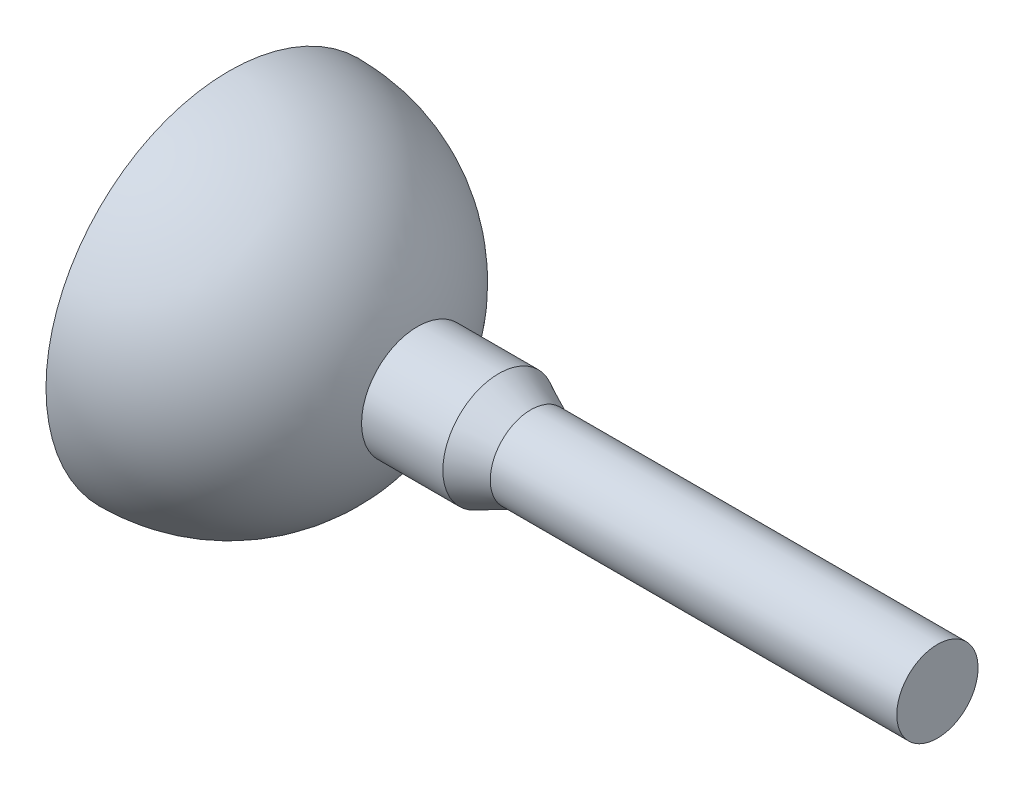
ISO-10303-21;
HEADER;
FILE_DESCRIPTION(('STEP AP214'),'2;1');
FILE_NAME('part.step','',(''),(''),'','','');
FILE_SCHEMA(('AUTOMOTIVE_DESIGN { 1 0 10303 214 1 1 1 1 }'));
ENDSEC;
DATA;
#1=APPLICATION_CONTEXT('core data for automotive mechanical design processes');
#2=APPLICATION_PROTOCOL_DEFINITION('international standard','automotive_design',2000,#1);
#3=PRODUCT_CONTEXT('',#1,'mechanical');
#4=PRODUCT('Part','Part','',(#3));
#5=PRODUCT_RELATED_PRODUCT_CATEGORY('part','',(#4));
#6=PRODUCT_DEFINITION_FORMATION('','',#4);
#7=PRODUCT_DEFINITION_CONTEXT('part definition',#1,'design');
#8=PRODUCT_DEFINITION('design','',#6,#7);
#9=PRODUCT_DEFINITION_SHAPE('','',#8);
#10=(LENGTH_UNIT() NAMED_UNIT(*) SI_UNIT(.MILLI.,.METRE.));
#11=(NAMED_UNIT(*) PLANE_ANGLE_UNIT() SI_UNIT($,.RADIAN.));
#12=(NAMED_UNIT(*) SI_UNIT($,.STERADIAN.) SOLID_ANGLE_UNIT());
#13=UNCERTAINTY_MEASURE_WITH_UNIT(LENGTH_MEASURE(1.E-05),#10,'distance_accuracy_value','');
#14=(GEOMETRIC_REPRESENTATION_CONTEXT(3) GLOBAL_UNCERTAINTY_ASSIGNED_CONTEXT((#13)) GLOBAL_UNIT_ASSIGNED_CONTEXT((#10,
#11,#12)) REPRESENTATION_CONTEXT('',''));
#15=CARTESIAN_POINT('',(0.,0.,0.));
#16=DIRECTION('',(0.,0.,1.));
#17=DIRECTION('',(1.,0.,0.));
#18=AXIS2_PLACEMENT_3D('',#15,#16,#17);
#19=CARTESIAN_POINT('',(4.41205459753535,0.,0.));
#20=DIRECTION('',(-1.,0.,0.));
#21=DIRECTION('',(0.,0.,1.));
#22=AXIS2_PLACEMENT_3D('',#19,#20,#21);
#23=CONICAL_SURFACE('',#22,2.,0.442925740322124);
#24=CARTESIAN_POINT('',(2.83097577527329,0.,0.));
#25=DIRECTION('',(-1.,0.,0.));
#26=DIRECTION('',(0.,0.,1.));
#27=AXIS2_PLACEMENT_3D('',#24,#25,#26);
#28=CIRCLE('',#27,2.75);
#29=CARTESIAN_POINT('',(2.83097577527329,0.,2.75));
#30=VERTEX_POINT('',#29);
#31=EDGE_CURVE('E10',#30,#30,#28,.T.);
#32=ORIENTED_EDGE('',*,*,#31,.F.);
#33=EDGE_LOOP('',(#32));
#34=FACE_BOUND('',#33,.T.);
#35=CARTESIAN_POINT('',(4.41205459753535,0.,0.));
#36=DIRECTION('',(-1.,0.,0.));
#37=DIRECTION('',(0.,0.,1.));
#38=AXIS2_PLACEMENT_3D('',#35,#36,#37);
#39=CIRCLE('',#38,2.);
#40=CARTESIAN_POINT('',(4.41205459753535,0.,2.));
#41=VERTEX_POINT('',#40);
#42=EDGE_CURVE('E55',#41,#41,#39,.T.);
#43=ORIENTED_EDGE('',*,*,#42,.T.);
#44=EDGE_LOOP('',(#43));
#45=FACE_BOUND('',#44,.T.);
#46=ADVANCED_FACE('F30',(#34,#45),#23,.T.);
#47=CARTESIAN_POINT('',(0.,0.,0.));
#48=DIRECTION('',(-1.,0.,0.));
#49=DIRECTION('',(0.,0.,1.));
#50=AXIS2_PLACEMENT_3D('',#47,#48,#49);
#51=CYLINDRICAL_SURFACE('',#50,2.75);
#52=CARTESIAN_POINT('',(-1.16902422472671,0.,0.));
#53=DIRECTION('',(-1.,0.,0.));
#54=DIRECTION('',(0.,0.,1.));
#55=AXIS2_PLACEMENT_3D('',#52,#53,#54);
#56=CIRCLE('',#55,2.75);
#57=CARTESIAN_POINT('',(-1.16902422472671,0.,2.75));
#58=VERTEX_POINT('',#57);
#59=EDGE_CURVE('E36',#58,#58,#56,.T.);
#60=ORIENTED_EDGE('',*,*,#59,.F.);
#61=EDGE_LOOP('',(#60));
#62=FACE_BOUND('',#61,.T.);
#63=ORIENTED_EDGE('',*,*,#31,.T.);
#64=EDGE_LOOP('',(#63));
#65=FACE_BOUND('',#64,.T.);
#66=ADVANCED_FACE('F77',(#62,#65),#51,.T.);
#67=CARTESIAN_POINT('',(-1.16902422472671,2.,0.));
#68=DIRECTION('',(1.,0.,0.));
#69=DIRECTION('',(0.,0.,-1.));
#70=AXIS2_PLACEMENT_3D('',#67,#68,#69);
#71=PLANE('',#70);
#72=CARTESIAN_POINT('',(-1.16902422472671,0.,0.));
#73=DIRECTION('',(-1.,0.,0.));
#74=DIRECTION('',(0.,0.,1.));
#75=AXIS2_PLACEMENT_3D('',#72,#73,#74);
#76=CIRCLE('',#75,2.);
#77=CARTESIAN_POINT('',(-1.16902422472671,0.,2.));
#78=VERTEX_POINT('',#77);
#79=EDGE_CURVE('E40',#78,#78,#76,.T.);
#80=ORIENTED_EDGE('',*,*,#79,.F.);
#81=EDGE_LOOP('',(#80));
#82=FACE_BOUND('',#81,.T.);
#83=ORIENTED_EDGE('',*,*,#59,.T.);
#84=EDGE_LOOP('',(#83));
#85=FACE_BOUND('',#84,.T.);
#86=ADVANCED_FACE('F82',(#82,#85),#71,.F.);
#87=CARTESIAN_POINT('',(0.,0.,0.));
#88=DIRECTION('',(-1.,0.,0.));
#89=DIRECTION('',(0.,0.,1.));
#90=AXIS2_PLACEMENT_3D('',#87,#88,#89);
#91=CYLINDRICAL_SURFACE('',#90,2.);
#92=CARTESIAN_POINT('',(-1.6690242247267,0.,0.));
#93=DIRECTION('',(-1.,0.,0.));
#94=DIRECTION('',(0.,0.,1.));
#95=AXIS2_PLACEMENT_3D('',#92,#93,#94);
#96=CIRCLE('',#95,2.);
#97=CARTESIAN_POINT('',(-1.6690242247267,0.,2.));
#98=VERTEX_POINT('',#97);
#99=EDGE_CURVE('E44',#98,#98,#96,.T.);
#100=ORIENTED_EDGE('',*,*,#99,.F.);
#101=EDGE_LOOP('',(#100));
#102=FACE_BOUND('',#101,.T.);
#103=ORIENTED_EDGE('',*,*,#79,.T.);
#104=EDGE_LOOP('',(#103));
#105=FACE_BOUND('',#104,.T.);
#106=ADVANCED_FACE('F87',(#102,#105),#91,.T.);
#107=CARTESIAN_POINT('',(-10.4439886121188,0.,0.));
#108=DIRECTION('',(-1.,0.,0.));
#109=DIRECTION('',(0.,1.,0.));
#110=AXIS2_PLACEMENT_3D('',#107,#108,#109);
#111=SPHERICAL_SURFACE('',#110,9.00000000000001);
#112=CARTESIAN_POINT('',(-10.4439886121188,0.,0.));
#113=DIRECTION('',(-1.,0.,0.));
#114=DIRECTION('',(0.,0.,1.));
#115=AXIS2_PLACEMENT_3D('',#112,#113,#114);
#116=CIRCLE('',#115,9.00000000000001);
#117=CARTESIAN_POINT('',(-10.4439886121188,0.,9.00000000000001));
#118=VERTEX_POINT('',#117);
#119=EDGE_CURVE('E49',#118,#118,#116,.T.);
#120=ORIENTED_EDGE('',*,*,#119,.F.);
#121=EDGE_LOOP('',(#120));
#122=FACE_BOUND('',#121,.T.);
#123=ORIENTED_EDGE('',*,*,#99,.T.);
#124=EDGE_LOOP('',(#123));
#125=FACE_BOUND('',#124,.T.);
#126=ADVANCED_FACE('F73',(#122,#125),#111,.T.);
#127=CARTESIAN_POINT('',(-10.4439886121188,0.,0.));
#128=DIRECTION('',(1.,0.,0.));
#129=DIRECTION('',(0.,0.,-1.));
#130=AXIS2_PLACEMENT_3D('',#127,#128,#129);
#131=PLANE('',#130);
#132=ORIENTED_EDGE('',*,*,#119,.T.);
#133=EDGE_LOOP('',(#132));
#134=FACE_BOUND('',#133,.T.);
#135=ADVANCED_FACE('F68',(#134),#131,.F.);
#136=CARTESIAN_POINT('',(24.4120545975354,2.,0.));
#137=DIRECTION('',(-1.,0.,0.));
#138=DIRECTION('',(0.,0.,1.));
#139=AXIS2_PLACEMENT_3D('',#136,#137,#138);
#140=PLANE('',#139);
#141=CARTESIAN_POINT('',(24.4120545975354,0.,0.));
#142=DIRECTION('',(-1.,0.,0.));
#143=DIRECTION('',(0.,0.,1.));
#144=AXIS2_PLACEMENT_3D('',#141,#142,#143);
#145=CIRCLE('',#144,2.);
#146=CARTESIAN_POINT('',(24.4120545975354,0.,2.));
#147=VERTEX_POINT('',#146);
#148=EDGE_CURVE('E52',#147,#147,#145,.T.);
#149=ORIENTED_EDGE('',*,*,#148,.F.);
#150=EDGE_LOOP('',(#149));
#151=FACE_BOUND('',#150,.T.);
#152=ADVANCED_FACE('F63',(#151),#140,.F.);
#153=CARTESIAN_POINT('',(0.,0.,0.));
#154=DIRECTION('',(-1.,0.,0.));
#155=DIRECTION('',(0.,0.,1.));
#156=AXIS2_PLACEMENT_3D('',#153,#154,#155);
#157=CYLINDRICAL_SURFACE('',#156,2.);
#158=ORIENTED_EDGE('',*,*,#42,.F.);
#159=EDGE_LOOP('',(#158));
#160=FACE_BOUND('',#159,.T.);
#161=ORIENTED_EDGE('',*,*,#148,.T.);
#162=EDGE_LOOP('',(#161));
#163=FACE_BOUND('',#162,.T.);
#164=ADVANCED_FACE('F60',(#160,#163),#157,.T.);
#165=CLOSED_SHELL('',(#46,#66,#86,#106,#126,#135,#152,#164));
#166=MANIFOLD_SOLID_BREP('B2',#165);
#167=ADVANCED_BREP_SHAPE_REPRESENTATION('',(#18,#166),#14);
#168=SHAPE_DEFINITION_REPRESENTATION(#9,#167);
ENDSEC;
END-ISO-10303-21;
